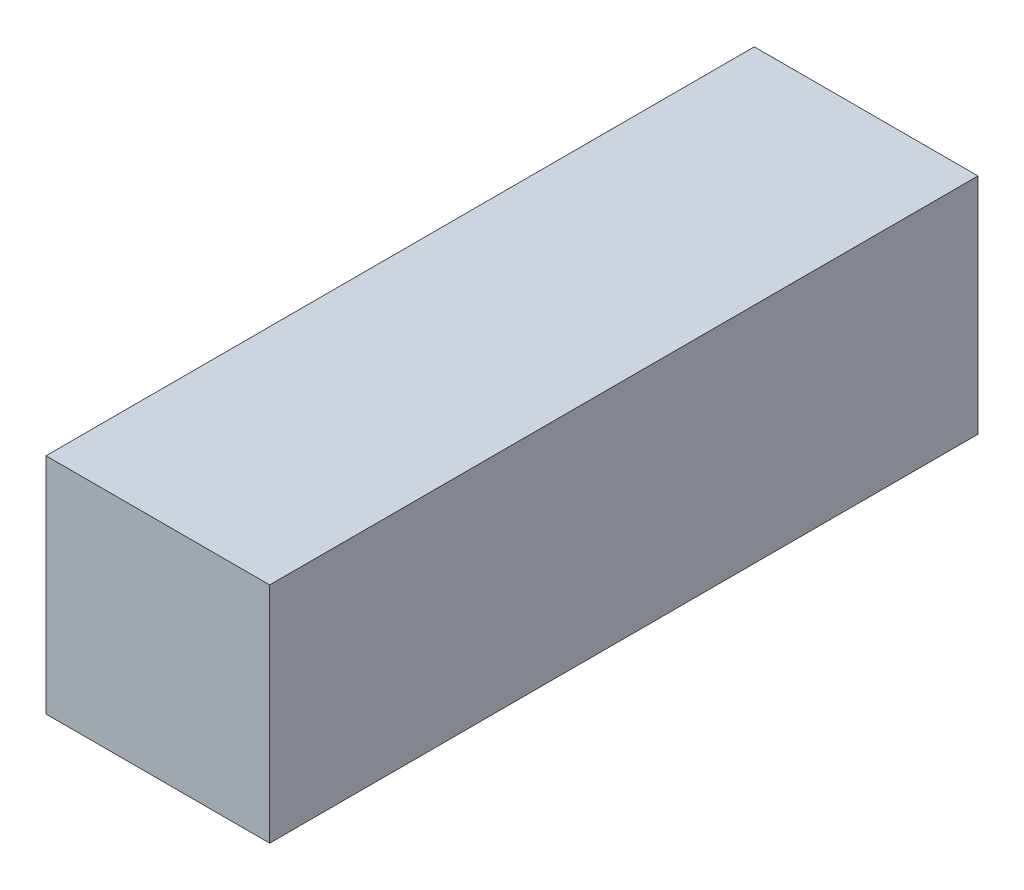
ISO-10303-21;
HEADER;
FILE_DESCRIPTION(('STEP AP214'),'2;1');
FILE_NAME('part.step','',(''),(''),'','','');
FILE_SCHEMA(('AUTOMOTIVE_DESIGN { 1 0 10303 214 1 1 1 1 }'));
ENDSEC;
DATA;
#1=APPLICATION_CONTEXT('core data for automotive mechanical design processes');
#2=APPLICATION_PROTOCOL_DEFINITION('international standard','automotive_design',2000,#1);
#3=PRODUCT_CONTEXT('',#1,'mechanical');
#4=PRODUCT('Part','Part','',(#3));
#5=PRODUCT_RELATED_PRODUCT_CATEGORY('part','',(#4));
#6=PRODUCT_DEFINITION_FORMATION('','',#4);
#7=PRODUCT_DEFINITION_CONTEXT('part definition',#1,'design');
#8=PRODUCT_DEFINITION('design','',#6,#7);
#9=PRODUCT_DEFINITION_SHAPE('','',#8);
#10=(LENGTH_UNIT() NAMED_UNIT(*) SI_UNIT(.MILLI.,.METRE.));
#11=(NAMED_UNIT(*) PLANE_ANGLE_UNIT() SI_UNIT($,.RADIAN.));
#12=(NAMED_UNIT(*) SI_UNIT($,.STERADIAN.) SOLID_ANGLE_UNIT());
#13=UNCERTAINTY_MEASURE_WITH_UNIT(LENGTH_MEASURE(1.E-05),#10,'distance_accuracy_value','');
#14=(GEOMETRIC_REPRESENTATION_CONTEXT(3) GLOBAL_UNCERTAINTY_ASSIGNED_CONTEXT((#13)) GLOBAL_UNIT_ASSIGNED_CONTEXT((#10,
#11,#12)) REPRESENTATION_CONTEXT('',''));
#15=CARTESIAN_POINT('',(0.,0.,0.));
#16=DIRECTION('',(0.,0.,1.));
#17=DIRECTION('',(1.,0.,0.));
#18=AXIS2_PLACEMENT_3D('',#15,#16,#17);
#19=CARTESIAN_POINT('',(1.5,1.5,-9.5));
#20=DIRECTION('',(-1.,0.,0.));
#21=DIRECTION('',(0.,-1.,0.));
#22=AXIS2_PLACEMENT_3D('',#19,#20,#21);
#23=PLANE('',#22);
#24=DIRECTION('',(0.,1.,0.));
#25=VECTOR('',#24,1.);
#26=CARTESIAN_POINT('',(1.5,1.5,0.));
#27=LINE('',#26,#25);
#28=CARTESIAN_POINT('',(1.5,-1.5,0.));
#29=VERTEX_POINT('',#28);
#30=CARTESIAN_POINT('',(1.5,1.5,0.));
#31=VERTEX_POINT('',#30);
#32=EDGE_CURVE('E102',#29,#31,#27,.T.);
#33=ORIENTED_EDGE('',*,*,#32,.F.);
#34=DIRECTION('',(0.,0.,1.));
#35=VECTOR('',#34,1.);
#36=CARTESIAN_POINT('',(1.5,-1.5,-9.5));
#37=LINE('',#36,#35);
#38=CARTESIAN_POINT('',(1.5,-1.5,-9.5));
#39=VERTEX_POINT('',#38);
#40=EDGE_CURVE('E101',#39,#29,#37,.T.);
#41=ORIENTED_EDGE('',*,*,#40,.F.);
#42=DIRECTION('',(0.,1.,0.));
#43=VECTOR('',#42,1.);
#44=CARTESIAN_POINT('',(1.5,1.5,-9.5));
#45=LINE('',#44,#43);
#46=CARTESIAN_POINT('',(1.5,1.5,-9.5));
#47=VERTEX_POINT('',#46);
#48=EDGE_CURVE('E96',#39,#47,#45,.T.);
#49=ORIENTED_EDGE('',*,*,#48,.T.);
#50=DIRECTION('',(0.,0.,1.));
#51=VECTOR('',#50,1.);
#52=CARTESIAN_POINT('',(1.5,1.5,-9.5));
#53=LINE('',#52,#51);
#54=EDGE_CURVE('E11',#47,#31,#53,.T.);
#55=ORIENTED_EDGE('',*,*,#54,.T.);
#56=EDGE_LOOP('',(#33,#41,#49,#55));
#57=FACE_BOUND('',#56,.T.);
#58=ADVANCED_FACE('F39',(#57),#23,.F.);
#59=CARTESIAN_POINT('',(-1.5,1.5,-9.5));
#60=DIRECTION('',(0.,-1.,0.));
#61=DIRECTION('',(0.,0.,1.));
#62=AXIS2_PLACEMENT_3D('',#59,#60,#61);
#63=PLANE('',#62);
#64=DIRECTION('',(-1.,0.,0.));
#65=VECTOR('',#64,1.);
#66=CARTESIAN_POINT('',(-1.5,1.5,0.));
#67=LINE('',#66,#65);
#68=CARTESIAN_POINT('',(-1.5,1.5,0.));
#69=VERTEX_POINT('',#68);
#70=EDGE_CURVE('E104',#31,#69,#67,.T.);
#71=ORIENTED_EDGE('',*,*,#70,.F.);
#72=ORIENTED_EDGE('',*,*,#54,.F.);
#73=DIRECTION('',(-1.,0.,0.));
#74=VECTOR('',#73,1.);
#75=CARTESIAN_POINT('',(-1.5,1.5,-9.5));
#76=LINE('',#75,#74);
#77=CARTESIAN_POINT('',(-1.5,1.5,-9.5));
#78=VERTEX_POINT('',#77);
#79=EDGE_CURVE('E80',#47,#78,#76,.T.);
#80=ORIENTED_EDGE('',*,*,#79,.T.);
#81=DIRECTION('',(0.,0.,1.));
#82=VECTOR('',#81,1.);
#83=CARTESIAN_POINT('',(-1.5,1.5,-9.5));
#84=LINE('',#83,#82);
#85=EDGE_CURVE('E47',#78,#69,#84,.T.);
#86=ORIENTED_EDGE('',*,*,#85,.T.);
#87=EDGE_LOOP('',(#71,#72,#80,#86));
#88=FACE_BOUND('',#87,.T.);
#89=ADVANCED_FACE('F94',(#88),#63,.F.);
#90=CARTESIAN_POINT('',(-1.5,1.5,-9.5));
#91=DIRECTION('',(1.,0.,0.));
#92=DIRECTION('',(0.,0.,1.));
#93=AXIS2_PLACEMENT_3D('',#90,#91,#92);
#94=PLANE('',#93);
#95=DIRECTION('',(0.,-1.,0.));
#96=VECTOR('',#95,1.);
#97=CARTESIAN_POINT('',(-1.5,1.5,0.));
#98=LINE('',#97,#96);
#99=CARTESIAN_POINT('',(-1.5,-1.5,0.));
#100=VERTEX_POINT('',#99);
#101=EDGE_CURVE('E90',#69,#100,#98,.T.);
#102=ORIENTED_EDGE('',*,*,#101,.F.);
#103=ORIENTED_EDGE('',*,*,#85,.F.);
#104=DIRECTION('',(0.,-1.,0.));
#105=VECTOR('',#104,1.);
#106=CARTESIAN_POINT('',(-1.5,1.5,-9.5));
#107=LINE('',#106,#105);
#108=CARTESIAN_POINT('',(-1.5,-1.5,-9.5));
#109=VERTEX_POINT('',#108);
#110=EDGE_CURVE('E83',#78,#109,#107,.T.);
#111=ORIENTED_EDGE('',*,*,#110,.T.);
#112=DIRECTION('',(0.,0.,1.));
#113=VECTOR('',#112,1.);
#114=CARTESIAN_POINT('',(-1.5,-1.5,-9.5));
#115=LINE('',#114,#113);
#116=EDGE_CURVE('E93',#109,#100,#115,.T.);
#117=ORIENTED_EDGE('',*,*,#116,.T.);
#118=EDGE_LOOP('',(#102,#103,#111,#117));
#119=FACE_BOUND('',#118,.T.);
#120=ADVANCED_FACE('F89',(#119),#94,.F.);
#121=CARTESIAN_POINT('',(-1.5,-1.5,-9.5));
#122=DIRECTION('',(0.,1.,0.));
#123=DIRECTION('',(0.,0.,-1.));
#124=AXIS2_PLACEMENT_3D('',#121,#122,#123);
#125=PLANE('',#124);
#126=DIRECTION('',(1.,0.,0.));
#127=VECTOR('',#126,1.);
#128=CARTESIAN_POINT('',(-1.5,-1.5,0.));
#129=LINE('',#128,#127);
#130=EDGE_CURVE('E69',#100,#29,#129,.T.);
#131=ORIENTED_EDGE('',*,*,#130,.F.);
#132=ORIENTED_EDGE('',*,*,#116,.F.);
#133=DIRECTION('',(1.,0.,0.));
#134=VECTOR('',#133,1.);
#135=CARTESIAN_POINT('',(-1.5,-1.5,-9.5));
#136=LINE('',#135,#134);
#137=EDGE_CURVE('E55',#109,#39,#136,.T.);
#138=ORIENTED_EDGE('',*,*,#137,.T.);
#139=ORIENTED_EDGE('',*,*,#40,.T.);
#140=EDGE_LOOP('',(#131,#132,#138,#139));
#141=FACE_BOUND('',#140,.T.);
#142=ADVANCED_FACE('F113',(#141),#125,.F.);
#143=CARTESIAN_POINT('',(0.,0.,-9.5));
#144=DIRECTION('',(0.,0.,-1.));
#145=DIRECTION('',(1.,0.,0.));
#146=AXIS2_PLACEMENT_3D('',#143,#144,#145);
#147=PLANE('',#146);
#148=ORIENTED_EDGE('',*,*,#48,.F.);
#149=ORIENTED_EDGE('',*,*,#137,.F.);
#150=ORIENTED_EDGE('',*,*,#110,.F.);
#151=ORIENTED_EDGE('',*,*,#79,.F.);
#152=EDGE_LOOP('',(#148,#149,#150,#151));
#153=FACE_BOUND('',#152,.T.);
#154=ADVANCED_FACE('F85',(#153),#147,.T.);
#155=CARTESIAN_POINT('',(0.,0.,0.));
#156=DIRECTION('',(0.,0.,-1.));
#157=DIRECTION('',(1.,0.,0.));
#158=AXIS2_PLACEMENT_3D('',#155,#156,#157);
#159=PLANE('',#158);
#160=ORIENTED_EDGE('',*,*,#32,.T.);
#161=ORIENTED_EDGE('',*,*,#70,.T.);
#162=ORIENTED_EDGE('',*,*,#101,.T.);
#163=ORIENTED_EDGE('',*,*,#130,.T.);
#164=EDGE_LOOP('',(#160,#161,#162,#163));
#165=FACE_BOUND('',#164,.T.);
#166=ADVANCED_FACE('F109',(#165),#159,.F.);
#167=CLOSED_SHELL('',(#58,#89,#120,#142,#154,#166));
#168=MANIFOLD_SOLID_BREP('B2',#167);
#169=ADVANCED_BREP_SHAPE_REPRESENTATION('',(#18,#168),#14);
#170=SHAPE_DEFINITION_REPRESENTATION(#9,#169);
ENDSEC;
END-ISO-10303-21;
